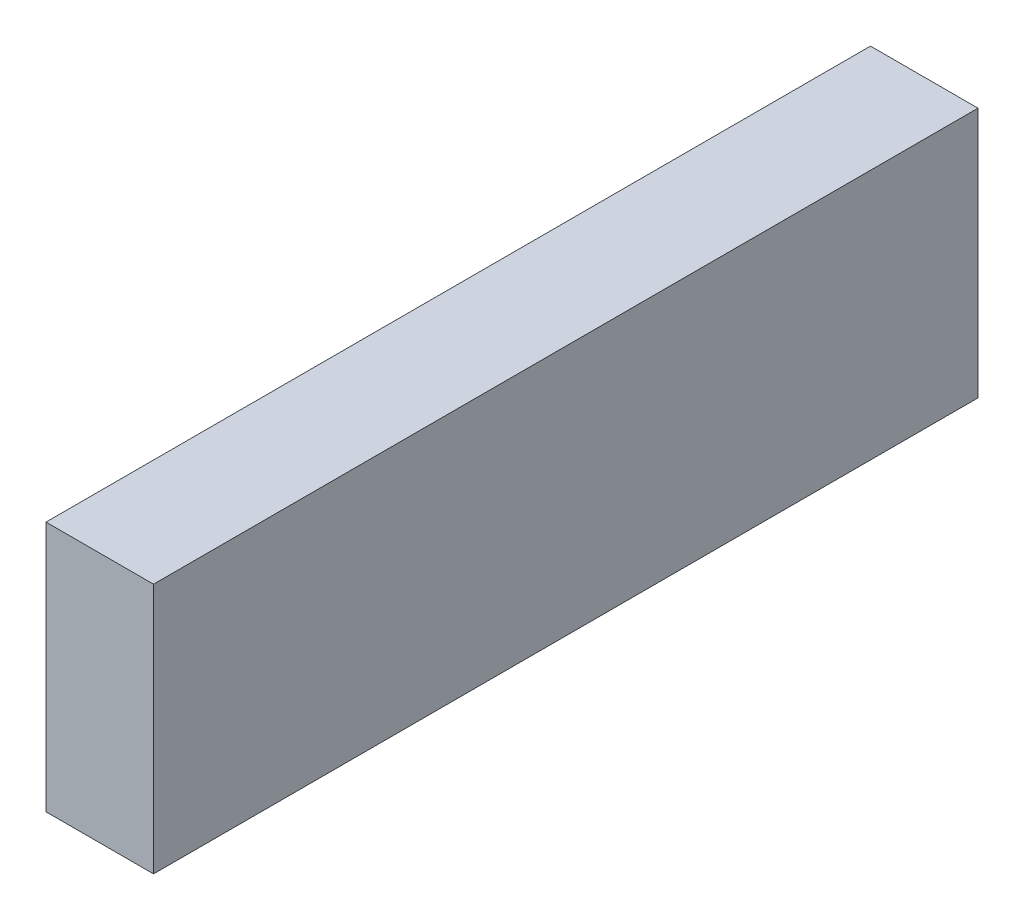
ISO-10303-21;
HEADER;
FILE_DESCRIPTION(('STEP AP214'),'2;1');
FILE_NAME('part.step','',(''),(''),'','','');
FILE_SCHEMA(('AUTOMOTIVE_DESIGN { 1 0 10303 214 1 1 1 1 }'));
ENDSEC;
DATA;
#1=APPLICATION_CONTEXT('core data for automotive mechanical design processes');
#2=APPLICATION_PROTOCOL_DEFINITION('international standard','automotive_design',2000,#1);
#3=PRODUCT_CONTEXT('',#1,'mechanical');
#4=PRODUCT('Part','Part','',(#3));
#5=PRODUCT_RELATED_PRODUCT_CATEGORY('part','',(#4));
#6=PRODUCT_DEFINITION_FORMATION('','',#4);
#7=PRODUCT_DEFINITION_CONTEXT('part definition',#1,'design');
#8=PRODUCT_DEFINITION('design','',#6,#7);
#9=PRODUCT_DEFINITION_SHAPE('','',#8);
#10=(LENGTH_UNIT() NAMED_UNIT(*) SI_UNIT(.MILLI.,.METRE.));
#11=(NAMED_UNIT(*) PLANE_ANGLE_UNIT() SI_UNIT($,.RADIAN.));
#12=(NAMED_UNIT(*) SI_UNIT($,.STERADIAN.) SOLID_ANGLE_UNIT());
#13=UNCERTAINTY_MEASURE_WITH_UNIT(LENGTH_MEASURE(1.E-05),#10,'distance_accuracy_value','');
#14=(GEOMETRIC_REPRESENTATION_CONTEXT(3) GLOBAL_UNCERTAINTY_ASSIGNED_CONTEXT((#13)) GLOBAL_UNIT_ASSIGNED_CONTEXT((#10,
#11,#12)) REPRESENTATION_CONTEXT('',''));
#15=CARTESIAN_POINT('',(0.,0.,0.));
#16=DIRECTION('',(0.,0.,1.));
#17=DIRECTION('',(1.,0.,0.));
#18=AXIS2_PLACEMENT_3D('',#15,#16,#17);
#19=CARTESIAN_POINT('',(914.4,1149.34999999999,292.1));
#20=DIRECTION('',(-1.,0.,0.));
#21=DIRECTION('',(0.,0.,1.));
#22=AXIS2_PLACEMENT_3D('',#19,#20,#21);
#23=PLANE('',#22);
#24=DIRECTION('',(0.,1.,0.));
#25=VECTOR('',#24,1.);
#26=CARTESIAN_POINT('',(914.4,1149.34999999999,0.));
#27=LINE('',#26,#25);
#28=CARTESIAN_POINT('',(914.4,1060.44999999999,0.));
#29=VERTEX_POINT('',#28);
#30=CARTESIAN_POINT('',(914.4,1149.34999999999,0.));
#31=VERTEX_POINT('',#30);
#32=EDGE_CURVE('E96',#29,#31,#27,.T.);
#33=ORIENTED_EDGE('',*,*,#32,.T.);
#34=DIRECTION('',(0.,0.,-1.));
#35=VECTOR('',#34,1.);
#36=CARTESIAN_POINT('',(914.4,1149.34999999999,292.1));
#37=LINE('',#36,#35);
#38=CARTESIAN_POINT('',(914.4,1149.34999999999,292.1));
#39=VERTEX_POINT('',#38);
#40=EDGE_CURVE('E11',#39,#31,#37,.T.);
#41=ORIENTED_EDGE('',*,*,#40,.F.);
#42=DIRECTION('',(0.,1.,0.));
#43=VECTOR('',#42,1.);
#44=CARTESIAN_POINT('',(914.4,1149.34999999999,292.1));
#45=LINE('',#44,#43);
#46=CARTESIAN_POINT('',(914.4,1060.44999999999,292.1));
#47=VERTEX_POINT('',#46);
#48=EDGE_CURVE('E84',#47,#39,#45,.T.);
#49=ORIENTED_EDGE('',*,*,#48,.F.);
#50=DIRECTION('',(0.,0.,-1.));
#51=VECTOR('',#50,1.);
#52=CARTESIAN_POINT('',(914.4,1060.44999999999,292.1));
#53=LINE('',#52,#51);
#54=EDGE_CURVE('E92',#47,#29,#53,.T.);
#55=ORIENTED_EDGE('',*,*,#54,.T.);
#56=EDGE_LOOP('',(#33,#41,#49,#55));
#57=FACE_BOUND('',#56,.T.);
#58=ADVANCED_FACE('F33',(#57),#23,.F.);
#59=CARTESIAN_POINT('',(914.4,1149.34999999999,292.1));
#60=DIRECTION('',(0.,-1.,0.));
#61=DIRECTION('',(0.,0.,-1.));
#62=AXIS2_PLACEMENT_3D('',#59,#60,#61);
#63=PLANE('',#62);
#64=DIRECTION('',(-1.,0.,0.));
#65=VECTOR('',#64,1.);
#66=CARTESIAN_POINT('',(914.4,1149.34999999999,0.));
#67=LINE('',#66,#65);
#68=CARTESIAN_POINT('',(876.3,1149.34999999999,0.));
#69=VERTEX_POINT('',#68);
#70=EDGE_CURVE('E88',#31,#69,#67,.T.);
#71=ORIENTED_EDGE('',*,*,#70,.T.);
#72=DIRECTION('',(0.,0.,-1.));
#73=VECTOR('',#72,1.);
#74=CARTESIAN_POINT('',(876.3,1149.34999999999,292.1));
#75=LINE('',#74,#73);
#76=CARTESIAN_POINT('',(876.3,1149.34999999999,292.1));
#77=VERTEX_POINT('',#76);
#78=EDGE_CURVE('E41',#77,#69,#75,.T.);
#79=ORIENTED_EDGE('',*,*,#78,.F.);
#80=DIRECTION('',(-1.,0.,0.));
#81=VECTOR('',#80,1.);
#82=CARTESIAN_POINT('',(914.4,1149.34999999999,292.1));
#83=LINE('',#82,#81);
#84=EDGE_CURVE('E79',#39,#77,#83,.T.);
#85=ORIENTED_EDGE('',*,*,#84,.F.);
#86=ORIENTED_EDGE('',*,*,#40,.T.);
#87=EDGE_LOOP('',(#71,#79,#85,#86));
#88=FACE_BOUND('',#87,.T.);
#89=ADVANCED_FACE('F87',(#88),#63,.F.);
#90=CARTESIAN_POINT('',(876.3,1149.34999999999,292.1));
#91=DIRECTION('',(1.,0.,0.));
#92=DIRECTION('',(0.,0.,-1.));
#93=AXIS2_PLACEMENT_3D('',#90,#91,#92);
#94=PLANE('',#93);
#95=DIRECTION('',(0.,-1.,0.));
#96=VECTOR('',#95,1.);
#97=CARTESIAN_POINT('',(876.3,1149.34999999999,0.));
#98=LINE('',#97,#96);
#99=CARTESIAN_POINT('',(876.3,1060.44999999999,0.));
#100=VERTEX_POINT('',#99);
#101=EDGE_CURVE('E66',#69,#100,#98,.T.);
#102=ORIENTED_EDGE('',*,*,#101,.T.);
#103=DIRECTION('',(0.,0.,-1.));
#104=VECTOR('',#103,1.);
#105=CARTESIAN_POINT('',(876.3,1060.44999999999,292.1));
#106=LINE('',#105,#104);
#107=CARTESIAN_POINT('',(876.3,1060.44999999999,292.1));
#108=VERTEX_POINT('',#107);
#109=EDGE_CURVE('E89',#108,#100,#106,.T.);
#110=ORIENTED_EDGE('',*,*,#109,.F.);
#111=DIRECTION('',(0.,-1.,0.));
#112=VECTOR('',#111,1.);
#113=CARTESIAN_POINT('',(876.3,1149.34999999999,292.1));
#114=LINE('',#113,#112);
#115=EDGE_CURVE('E82',#77,#108,#114,.T.);
#116=ORIENTED_EDGE('',*,*,#115,.F.);
#117=ORIENTED_EDGE('',*,*,#78,.T.);
#118=EDGE_LOOP('',(#102,#110,#116,#117));
#119=FACE_BOUND('',#118,.T.);
#120=ADVANCED_FACE('F90',(#119),#94,.F.);
#121=CARTESIAN_POINT('',(914.4,1060.44999999999,292.1));
#122=DIRECTION('',(0.,1.,0.));
#123=DIRECTION('',(0.,0.,1.));
#124=AXIS2_PLACEMENT_3D('',#121,#122,#123);
#125=PLANE('',#124);
#126=DIRECTION('',(1.,0.,0.));
#127=VECTOR('',#126,1.);
#128=CARTESIAN_POINT('',(914.4,1060.44999999999,0.));
#129=LINE('',#128,#127);
#130=EDGE_CURVE('E72',#100,#29,#129,.T.);
#131=ORIENTED_EDGE('',*,*,#130,.T.);
#132=ORIENTED_EDGE('',*,*,#54,.F.);
#133=DIRECTION('',(1.,0.,0.));
#134=VECTOR('',#133,1.);
#135=CARTESIAN_POINT('',(914.4,1060.44999999999,292.1));
#136=LINE('',#135,#134);
#137=EDGE_CURVE('E49',#108,#47,#136,.T.);
#138=ORIENTED_EDGE('',*,*,#137,.F.);
#139=ORIENTED_EDGE('',*,*,#109,.T.);
#140=EDGE_LOOP('',(#131,#132,#138,#139));
#141=FACE_BOUND('',#140,.T.);
#142=ADVANCED_FACE('F103',(#141),#125,.F.);
#143=CARTESIAN_POINT('',(0.,0.,292.1));
#144=DIRECTION('',(0.,0.,-1.));
#145=DIRECTION('',(-1.,0.,0.));
#146=AXIS2_PLACEMENT_3D('',#143,#144,#145);
#147=PLANE('',#146);
#148=ORIENTED_EDGE('',*,*,#48,.T.);
#149=ORIENTED_EDGE('',*,*,#84,.T.);
#150=ORIENTED_EDGE('',*,*,#115,.T.);
#151=ORIENTED_EDGE('',*,*,#137,.T.);
#152=EDGE_LOOP('',(#148,#149,#150,#151));
#153=FACE_BOUND('',#152,.T.);
#154=ADVANCED_FACE('F80',(#153),#147,.F.);
#155=CARTESIAN_POINT('',(0.,0.,0.));
#156=DIRECTION('',(0.,0.,-1.));
#157=DIRECTION('',(-1.,0.,0.));
#158=AXIS2_PLACEMENT_3D('',#155,#156,#157);
#159=PLANE('',#158);
#160=ORIENTED_EDGE('',*,*,#32,.F.);
#161=ORIENTED_EDGE('',*,*,#130,.F.);
#162=ORIENTED_EDGE('',*,*,#101,.F.);
#163=ORIENTED_EDGE('',*,*,#70,.F.);
#164=EDGE_LOOP('',(#160,#161,#162,#163));
#165=FACE_BOUND('',#164,.T.);
#166=ADVANCED_FACE('F106',(#165),#159,.T.);
#167=CLOSED_SHELL('',(#58,#89,#120,#142,#154,#166));
#168=MANIFOLD_SOLID_BREP('B2',#167);
#169=ADVANCED_BREP_SHAPE_REPRESENTATION('',(#18,#168),#14);
#170=SHAPE_DEFINITION_REPRESENTATION(#9,#169);
ENDSEC;
END-ISO-10303-21;
